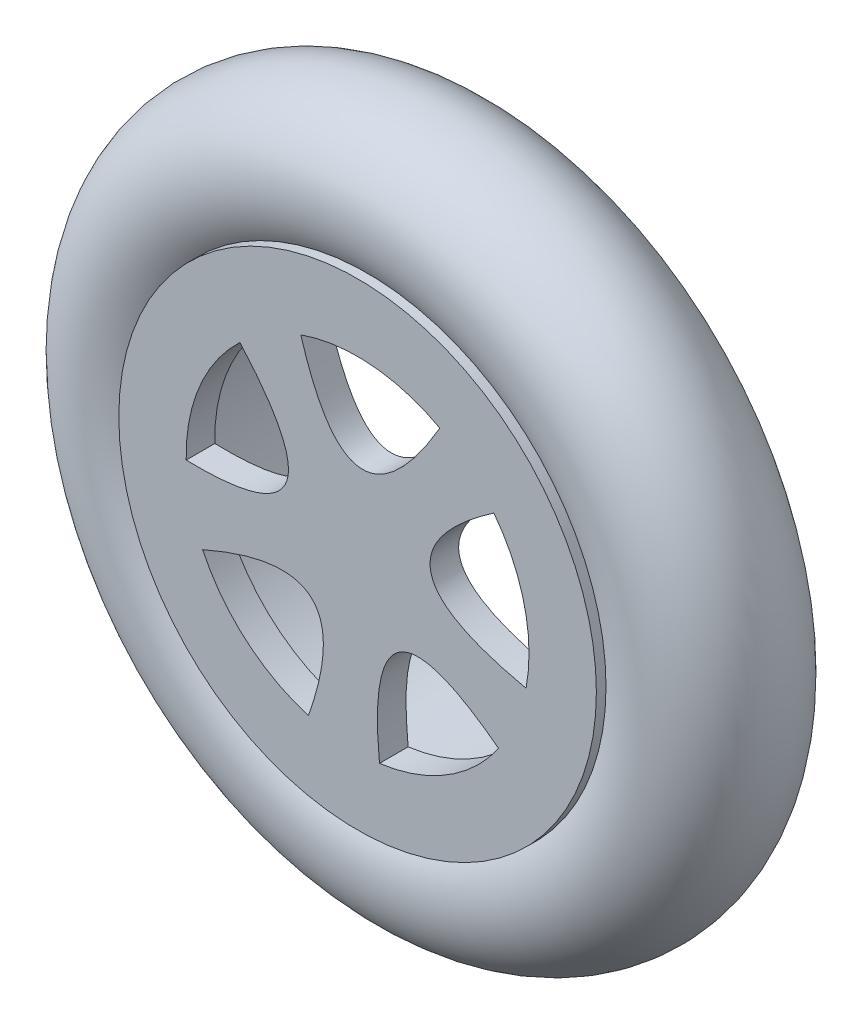
ISO-10303-21;
HEADER;
FILE_DESCRIPTION(('STEP AP214'),'2;1');
FILE_NAME('part.step','',(''),(''),'','','');
FILE_SCHEMA(('AUTOMOTIVE_DESIGN { 1 0 10303 214 1 1 1 1 }'));
ENDSEC;
DATA;
#1=APPLICATION_CONTEXT('core data for automotive mechanical design processes');
#2=APPLICATION_PROTOCOL_DEFINITION('international standard','automotive_design',2000,#1);
#3=PRODUCT_CONTEXT('',#1,'mechanical');
#4=PRODUCT('Part','Part','',(#3));
#5=PRODUCT_RELATED_PRODUCT_CATEGORY('part','',(#4));
#6=PRODUCT_DEFINITION_FORMATION('','',#4);
#7=PRODUCT_DEFINITION_CONTEXT('part definition',#1,'design');
#8=PRODUCT_DEFINITION('design','',#6,#7);
#9=PRODUCT_DEFINITION_SHAPE('','',#8);
#10=(LENGTH_UNIT() NAMED_UNIT(*) SI_UNIT(.MILLI.,.METRE.));
#11=(NAMED_UNIT(*) PLANE_ANGLE_UNIT() SI_UNIT($,.RADIAN.));
#12=(NAMED_UNIT(*) SI_UNIT($,.STERADIAN.) SOLID_ANGLE_UNIT());
#13=UNCERTAINTY_MEASURE_WITH_UNIT(LENGTH_MEASURE(1.E-05),#10,'distance_accuracy_value','');
#14=(GEOMETRIC_REPRESENTATION_CONTEXT(3) GLOBAL_UNCERTAINTY_ASSIGNED_CONTEXT((#13)) GLOBAL_UNIT_ASSIGNED_CONTEXT((#10,
#11,#12)) REPRESENTATION_CONTEXT('',''));
#15=CARTESIAN_POINT('',(0.,0.,0.));
#16=DIRECTION('',(0.,0.,1.));
#17=DIRECTION('',(1.,0.,0.));
#18=AXIS2_PLACEMENT_3D('',#15,#16,#17);
#19=CARTESIAN_POINT('',(87.3649786951186,-16.4490272539585,76.2));
#20=CARTESIAN_POINT('',(-3.01769573823827,3.07763110089649,76.2));
#21=CARTESIAN_POINT('',(70.6825906567093,53.9182842647656,76.2));
#22=B_SPLINE_CURVE_WITH_KNOTS('',2,(#19,#20,#21),.UNSPECIFIED.,.F.,.F.,(3,3),(0.,1.),.UNSPECIFIED.);
#23=DIRECTION('',(0.,0.,-1.));
#24=VECTOR('',#23,1.);
#25=SURFACE_OF_LINEAR_EXTRUSION('',#22,#24);
#26=CARTESIAN_POINT('',(87.3649786951186,-16.4490272539585,61.3570823232408));
#27=CARTESIAN_POINT('',(-3.01769573823827,3.07763110089649,61.3570823232408));
#28=CARTESIAN_POINT('',(70.6825906567093,53.9182842647656,61.3570823232408));
#29=B_SPLINE_CURVE_WITH_KNOTS('',2,(#26,#27,#28),.UNSPECIFIED.,.F.,.F.,(3,3),(0.,1.),.UNSPECIFIED.);
#30=CARTESIAN_POINT('',(70.6825906567093,53.9182842647656,61.3570823232408));
#31=VERTEX_POINT('',#30);
#32=CARTESIAN_POINT('',(87.3649786951186,-16.4490272539585,61.3570823232408));
#33=VERTEX_POINT('',#32);
#34=EDGE_CURVE('E67',#31,#33,#29,.F.);
#35=ORIENTED_EDGE('',*,*,#34,.F.);
#36=DIRECTION('',(0.,0.,-1.));
#37=VECTOR('',#36,1.);
#38=CARTESIAN_POINT('',(70.6825906567093,53.9182842647656,76.2));
#39=LINE('',#38,#37);
#40=CARTESIAN_POINT('',(70.6825906567093,53.9182842647656,76.2));
#41=VERTEX_POINT('',#40);
#42=EDGE_CURVE('E238',#41,#31,#39,.T.);
#43=ORIENTED_EDGE('',*,*,#42,.F.);
#44=CARTESIAN_POINT('',(87.3649786951186,-16.4490272539585,76.2));
#45=VERTEX_POINT('',#44);
#46=EDGE_CURVE('E223',#45,#41,#22,.T.);
#47=ORIENTED_EDGE('',*,*,#46,.F.);
#48=DIRECTION('',(0.,0.,-1.));
#49=VECTOR('',#48,1.);
#50=CARTESIAN_POINT('',(87.3649786951186,-16.4490272539585,76.2));
#51=LINE('',#50,#49);
#52=EDGE_CURVE('E239',#45,#33,#51,.T.);
#53=ORIENTED_EDGE('',*,*,#52,.T.);
#54=EDGE_LOOP('',(#35,#43,#47,#53));
#55=FACE_BOUND('',#54,.T.);
#56=ADVANCED_FACE('F53',(#55),#25,.F.);
#57=CARTESIAN_POINT('',(0.,0.,76.2));
#58=DIRECTION('',(0.,0.,-1.));
#59=DIRECTION('',(-1.,0.,0.));
#60=AXIS2_PLACEMENT_3D('',#57,#58,#59);
#61=CYLINDRICAL_SURFACE('',#60,88.9);
#62=CARTESIAN_POINT('',(0.,0.,61.3570823232408));
#63=DIRECTION('',(0.,0.,-1.));
#64=DIRECTION('',(-1.,0.,0.));
#65=AXIS2_PLACEMENT_3D('',#62,#63,#64);
#66=CIRCLE('',#65,88.9);
#67=EDGE_CURVE('E299',#33,#31,#66,.F.);
#68=ORIENTED_EDGE('',*,*,#67,.F.);
#69=ORIENTED_EDGE('',*,*,#52,.F.);
#70=CARTESIAN_POINT('',(0.,0.,76.2));
#71=DIRECTION('',(0.,0.,-1.));
#72=DIRECTION('',(-1.,0.,0.));
#73=AXIS2_PLACEMENT_3D('',#70,#71,#72);
#74=CIRCLE('',#73,88.9);
#75=EDGE_CURVE('E230',#41,#45,#74,.T.);
#76=ORIENTED_EDGE('',*,*,#75,.F.);
#77=ORIENTED_EDGE('',*,*,#42,.T.);
#78=EDGE_LOOP('',(#68,#69,#76,#77));
#79=FACE_BOUND('',#78,.T.);
#80=ADVANCED_FACE('F213',(#79),#61,.F.);
#81=CARTESIAN_POINT('',(11.353308573403,-88.1720612463897,76.2));
#82=CARTESIAN_POINT('',(1.99448184629178,3.82103950864149,76.2));
#83=CARTESIAN_POINT('',(73.1214573168308,-50.5614722873345,76.2));
#84=B_SPLINE_CURVE_WITH_KNOTS('',2,(#81,#82,#83),.UNSPECIFIED.,.F.,.F.,(3,3),(0.,1.),.UNSPECIFIED.);
#85=DIRECTION('',(0.,0.,-1.));
#86=VECTOR('',#85,1.);
#87=SURFACE_OF_LINEAR_EXTRUSION('',#84,#86);
#88=CARTESIAN_POINT('',(11.353308573403,-88.1720612463897,61.3570823232408));
#89=CARTESIAN_POINT('',(1.99448184629178,3.82103950864149,61.3570823232408));
#90=CARTESIAN_POINT('',(73.1214573168308,-50.5614722873345,61.3570823232408));
#91=B_SPLINE_CURVE_WITH_KNOTS('',2,(#88,#89,#90),.UNSPECIFIED.,.F.,.F.,(3,3),(0.,1.),.UNSPECIFIED.);
#92=CARTESIAN_POINT('',(73.1214573168308,-50.5614722873345,61.3570823232408));
#93=VERTEX_POINT('',#92);
#94=CARTESIAN_POINT('',(11.353308573403,-88.1720612463897,61.3570823232408));
#95=VERTEX_POINT('',#94);
#96=EDGE_CURVE('E74',#93,#95,#91,.F.);
#97=ORIENTED_EDGE('',*,*,#96,.F.);
#98=DIRECTION('',(0.,0.,-1.));
#99=VECTOR('',#98,1.);
#100=CARTESIAN_POINT('',(73.1214573168308,-50.5614722873345,76.2));
#101=LINE('',#100,#99);
#102=CARTESIAN_POINT('',(73.1214573168308,-50.5614722873345,76.2));
#103=VERTEX_POINT('',#102);
#104=EDGE_CURVE('E232',#103,#93,#101,.T.);
#105=ORIENTED_EDGE('',*,*,#104,.F.);
#106=CARTESIAN_POINT('',(11.353308573403,-88.1720612463897,76.2));
#107=VERTEX_POINT('',#106);
#108=EDGE_CURVE('E195',#107,#103,#84,.T.);
#109=ORIENTED_EDGE('',*,*,#108,.F.);
#110=DIRECTION('',(0.,0.,-1.));
#111=VECTOR('',#110,1.);
#112=CARTESIAN_POINT('',(11.353308573403,-88.1720612463897,76.2));
#113=LINE('',#112,#111);
#114=EDGE_CURVE('E231',#107,#95,#113,.T.);
#115=ORIENTED_EDGE('',*,*,#114,.T.);
#116=EDGE_LOOP('',(#97,#105,#109,#115));
#117=FACE_BOUND('',#116,.T.);
#118=ADVANCED_FACE('F209',(#117),#87,.F.);
#119=CARTESIAN_POINT('',(0.,0.,76.2));
#120=DIRECTION('',(0.,0.,-1.));
#121=DIRECTION('',(-1.,0.,0.));
#122=AXIS2_PLACEMENT_3D('',#119,#120,#121);
#123=CYLINDRICAL_SURFACE('',#122,88.9);
#124=CARTESIAN_POINT('',(0.,0.,61.3570823232408));
#125=DIRECTION('',(0.,0.,-1.));
#126=DIRECTION('',(-1.,0.,0.));
#127=AXIS2_PLACEMENT_3D('',#124,#125,#126);
#128=CIRCLE('',#127,88.9);
#129=EDGE_CURVE('E294',#95,#93,#128,.F.);
#130=ORIENTED_EDGE('',*,*,#129,.F.);
#131=ORIENTED_EDGE('',*,*,#114,.F.);
#132=CARTESIAN_POINT('',(0.,0.,76.2));
#133=DIRECTION('',(0.,0.,-1.));
#134=DIRECTION('',(-1.,0.,0.));
#135=AXIS2_PLACEMENT_3D('',#132,#133,#134);
#136=CIRCLE('',#135,88.9);
#137=EDGE_CURVE('E203',#103,#107,#136,.T.);
#138=ORIENTED_EDGE('',*,*,#137,.F.);
#139=ORIENTED_EDGE('',*,*,#104,.T.);
#140=EDGE_LOOP('',(#130,#131,#138,#139));
#141=FACE_BOUND('',#140,.T.);
#142=ADVANCED_FACE('F212',(#141),#123,.F.);
#143=CARTESIAN_POINT('',(0.,0.,76.2));
#144=DIRECTION('',(0.,0.,-1.));
#145=DIRECTION('',(-1.,0.,0.));
#146=AXIS2_PLACEMENT_3D('',#143,#144,#145);
#147=CYLINDRICAL_SURFACE('',#146,88.9);
#148=CARTESIAN_POINT('',(0.,0.,61.3570823232408));
#149=DIRECTION('',(0.,0.,-1.));
#150=DIRECTION('',(-1.,0.,0.));
#151=AXIS2_PLACEMENT_3D('',#148,#149,#150);
#152=CIRCLE('',#151,88.9);
#153=CARTESIAN_POINT('',(-80.34824811199,-38.0443034544478,61.3570823232408));
#154=VERTEX_POINT('',#153);
#155=CARTESIAN_POINT('',(-25.4910447279832,-85.1669926595742,61.3570823232408));
#156=VERTEX_POINT('',#155);
#157=EDGE_CURVE('E289',#154,#156,#152,.F.);
#158=ORIENTED_EDGE('',*,*,#157,.F.);
#159=DIRECTION('',(0.,0.,-1.));
#160=VECTOR('',#159,1.);
#161=CARTESIAN_POINT('',(-80.34824811199,-38.0443034544478,76.2));
#162=LINE('',#161,#160);
#163=CARTESIAN_POINT('',(-80.34824811199,-38.0443034544478,76.2));
#164=VERTEX_POINT('',#163);
#165=EDGE_CURVE('E186',#164,#154,#162,.T.);
#166=ORIENTED_EDGE('',*,*,#165,.F.);
#167=CARTESIAN_POINT('',(0.,0.,76.2));
#168=DIRECTION('',(0.,0.,-1.));
#169=DIRECTION('',(-1.,0.,0.));
#170=AXIS2_PLACEMENT_3D('',#167,#168,#169);
#171=CIRCLE('',#170,88.9);
#172=CARTESIAN_POINT('',(-25.4910447279832,-85.1669926595742,76.2));
#173=VERTEX_POINT('',#172);
#174=EDGE_CURVE('E187',#173,#164,#171,.T.);
#175=ORIENTED_EDGE('',*,*,#174,.F.);
#176=DIRECTION('',(0.,0.,-1.));
#177=VECTOR('',#176,1.);
#178=CARTESIAN_POINT('',(-25.4910447279832,-85.1669926595742,76.2));
#179=LINE('',#178,#177);
#180=EDGE_CURVE('E189',#173,#156,#179,.T.);
#181=ORIENTED_EDGE('',*,*,#180,.T.);
#182=EDGE_LOOP('',(#158,#166,#175,#181));
#183=FACE_BOUND('',#182,.T.);
#184=ADVANCED_FACE('F176',(#183),#147,.F.);
#185=CARTESIAN_POINT('',(-80.34824811199,-38.0443034544478,76.2));
#186=CARTESIAN_POINT('',(4.25035330919125,-0.716098812199793,76.2));
#187=CARTESIAN_POINT('',(-25.4910447279832,-85.1669926595742,76.2));
#188=B_SPLINE_CURVE_WITH_KNOTS('',2,(#185,#186,#187),.UNSPECIFIED.,.F.,.F.,(3,3),(0.,1.),.UNSPECIFIED.);
#189=DIRECTION('',(0.,0.,-1.));
#190=VECTOR('',#189,1.);
#191=SURFACE_OF_LINEAR_EXTRUSION('',#188,#190);
#192=CARTESIAN_POINT('',(-80.34824811199,-38.0443034544478,61.3570823232408));
#193=CARTESIAN_POINT('',(4.25035330919125,-0.716098812199793,61.3570823232408));
#194=CARTESIAN_POINT('',(-25.4910447279832,-85.1669926595742,61.3570823232408));
#195=B_SPLINE_CURVE_WITH_KNOTS('',2,(#192,#193,#194),.UNSPECIFIED.,.F.,.F.,(3,3),(0.,1.),.UNSPECIFIED.);
#196=EDGE_CURVE('E282',#156,#154,#195,.F.);
#197=ORIENTED_EDGE('',*,*,#196,.F.);
#198=ORIENTED_EDGE('',*,*,#180,.F.);
#199=EDGE_CURVE('E179',#164,#173,#188,.T.);
#200=ORIENTED_EDGE('',*,*,#199,.F.);
#201=ORIENTED_EDGE('',*,*,#165,.T.);
#202=EDGE_LOOP('',(#197,#198,#200,#201));
#203=FACE_BOUND('',#202,.T.);
#204=ADVANCED_FACE('F170',(#203),#191,.F.);
#205=CARTESIAN_POINT('',(-61.0112568431225,64.6593886332259,76.2));
#206=CARTESIAN_POINT('',(0.632380962984039,-4.26361291388443,76.2));
#207=CARTESIAN_POINT('',(-88.8757893674683,-2.07462389589522,76.2));
#208=B_SPLINE_CURVE_WITH_KNOTS('',2,(#205,#206,#207),.UNSPECIFIED.,.F.,.F.,(3,3),(0.,1.),.UNSPECIFIED.);
#209=DIRECTION('',(0.,0.,-1.));
#210=VECTOR('',#209,1.);
#211=SURFACE_OF_LINEAR_EXTRUSION('',#208,#210);
#212=CARTESIAN_POINT('',(-61.0112568431225,64.6593886332259,61.3570823232408));
#213=CARTESIAN_POINT('',(0.632380962984039,-4.26361291388443,61.3570823232408));
#214=CARTESIAN_POINT('',(-88.8757893674683,-2.07462389589522,61.3570823232408));
#215=B_SPLINE_CURVE_WITH_KNOTS('',2,(#212,#213,#214),.UNSPECIFIED.,.F.,.F.,(3,3),(0.,1.),.UNSPECIFIED.);
#216=CARTESIAN_POINT('',(-88.8757893674682,-2.07462389589516,61.3570823232408));
#217=VERTEX_POINT('',#216);
#218=CARTESIAN_POINT('',(-61.0112568431224,64.6593886332259,61.3570823232408));
#219=VERTEX_POINT('',#218);
#220=EDGE_CURVE('E278',#217,#219,#215,.F.);
#221=ORIENTED_EDGE('',*,*,#220,.F.);
#222=DIRECTION('',(0.,0.,-1.));
#223=VECTOR('',#222,1.);
#224=CARTESIAN_POINT('',(-88.8757893674683,-2.07462389589516,76.2));
#225=LINE('',#224,#223);
#226=CARTESIAN_POINT('',(-88.8757893674683,-2.07462389589516,76.2));
#227=VERTEX_POINT('',#226);
#228=EDGE_CURVE('E345',#227,#217,#225,.T.);
#229=ORIENTED_EDGE('',*,*,#228,.F.);
#230=CARTESIAN_POINT('',(-61.0112568431224,64.6593886332259,76.2));
#231=VERTEX_POINT('',#230);
#232=EDGE_CURVE('E149',#231,#227,#208,.T.);
#233=ORIENTED_EDGE('',*,*,#232,.F.);
#234=DIRECTION('',(0.,0.,-1.));
#235=VECTOR('',#234,1.);
#236=CARTESIAN_POINT('',(-61.0112568431224,64.6593886332259,76.2));
#237=LINE('',#236,#235);
#238=EDGE_CURVE('E343',#231,#219,#237,.T.);
#239=ORIENTED_EDGE('',*,*,#238,.T.);
#240=EDGE_LOOP('',(#221,#229,#233,#239));
#241=FACE_BOUND('',#240,.T.);
#242=ADVANCED_FACE('F165',(#241),#211,.F.);
#243=CARTESIAN_POINT('',(0.,0.,76.2));
#244=DIRECTION('',(0.,0.,-1.));
#245=DIRECTION('',(-1.,0.,0.));
#246=AXIS2_PLACEMENT_3D('',#243,#244,#245);
#247=CYLINDRICAL_SURFACE('',#246,88.9);
#248=CARTESIAN_POINT('',(0.,0.,61.3570823232408));
#249=DIRECTION('',(0.,0.,-1.));
#250=DIRECTION('',(-1.,0.,0.));
#251=AXIS2_PLACEMENT_3D('',#248,#249,#250);
#252=CIRCLE('',#251,88.9);
#253=EDGE_CURVE('E141',#219,#217,#252,.F.);
#254=ORIENTED_EDGE('',*,*,#253,.F.);
#255=ORIENTED_EDGE('',*,*,#238,.F.);
#256=CARTESIAN_POINT('',(0.,0.,76.2));
#257=DIRECTION('',(0.,0.,-1.));
#258=DIRECTION('',(-1.,0.,0.));
#259=AXIS2_PLACEMENT_3D('',#256,#257,#258);
#260=CIRCLE('',#259,88.9);
#261=EDGE_CURVE('E159',#227,#231,#260,.T.);
#262=ORIENTED_EDGE('',*,*,#261,.F.);
#263=ORIENTED_EDGE('',*,*,#228,.T.);
#264=EDGE_LOOP('',(#254,#255,#262,#263));
#265=FACE_BOUND('',#264,.T.);
#266=ADVANCED_FACE('F169',(#265),#247,.F.);
#267=CARTESIAN_POINT('',(42.6412176865906,78.00600332157,76.2));
#268=CARTESIAN_POINT('',(-3.85952038022872,-1.91895888345376,76.2));
#269=CARTESIAN_POINT('',(-29.4372138780887,83.8848045780383,76.2));
#270=B_SPLINE_CURVE_WITH_KNOTS('',2,(#267,#268,#269),.UNSPECIFIED.,.F.,.F.,(3,3),(0.,1.),.UNSPECIFIED.);
#271=DIRECTION('',(0.,0.,-1.));
#272=VECTOR('',#271,1.);
#273=SURFACE_OF_LINEAR_EXTRUSION('',#270,#272);
#274=CARTESIAN_POINT('',(42.6412176865906,78.00600332157,61.3570823232408));
#275=CARTESIAN_POINT('',(-3.85952038022872,-1.91895888345376,61.3570823232408));
#276=CARTESIAN_POINT('',(-29.4372138780887,83.8848045780383,61.3570823232408));
#277=B_SPLINE_CURVE_WITH_KNOTS('',2,(#274,#275,#276),.UNSPECIFIED.,.F.,.F.,(3,3),(0.,1.),.UNSPECIFIED.);
#278=CARTESIAN_POINT('',(-29.4372138780887,83.8848045780382,61.3570823232408));
#279=VERTEX_POINT('',#278);
#280=CARTESIAN_POINT('',(42.6412176865907,78.00600332157,61.3570823232408));
#281=VERTEX_POINT('',#280);
#282=EDGE_CURVE('E131',#279,#281,#277,.F.);
#283=ORIENTED_EDGE('',*,*,#282,.F.);
#284=DIRECTION('',(0.,0.,-1.));
#285=VECTOR('',#284,1.);
#286=CARTESIAN_POINT('',(-29.4372138780888,83.8848045780382,76.2));
#287=LINE('',#286,#285);
#288=CARTESIAN_POINT('',(-29.4372138780888,83.8848045780382,76.2));
#289=VERTEX_POINT('',#288);
#290=EDGE_CURVE('E138',#289,#279,#287,.T.);
#291=ORIENTED_EDGE('',*,*,#290,.F.);
#292=CARTESIAN_POINT('',(42.6412176865907,78.00600332157,76.2));
#293=VERTEX_POINT('',#292);
#294=EDGE_CURVE('E151',#293,#289,#270,.T.);
#295=ORIENTED_EDGE('',*,*,#294,.F.);
#296=DIRECTION('',(0.,0.,-1.));
#297=VECTOR('',#296,1.);
#298=CARTESIAN_POINT('',(42.6412176865907,78.00600332157,76.2));
#299=LINE('',#298,#297);
#300=EDGE_CURVE('E140',#293,#281,#299,.T.);
#301=ORIENTED_EDGE('',*,*,#300,.T.);
#302=EDGE_LOOP('',(#283,#291,#295,#301));
#303=FACE_BOUND('',#302,.T.);
#304=ADVANCED_FACE('F137',(#303),#273,.F.);
#305=CARTESIAN_POINT('',(0.,0.,76.2));
#306=DIRECTION('',(0.,0.,-1.));
#307=DIRECTION('',(-1.,0.,0.));
#308=AXIS2_PLACEMENT_3D('',#305,#306,#307);
#309=CYLINDRICAL_SURFACE('',#308,88.9);
#310=CARTESIAN_POINT('',(0.,0.,61.3570823232408));
#311=DIRECTION('',(0.,0.,-1.));
#312=DIRECTION('',(-1.,0.,0.));
#313=AXIS2_PLACEMENT_3D('',#310,#311,#312);
#314=CIRCLE('',#313,88.9);
#315=EDGE_CURVE('E12',#281,#279,#314,.F.);
#316=ORIENTED_EDGE('',*,*,#315,.F.);
#317=ORIENTED_EDGE('',*,*,#300,.F.);
#318=CARTESIAN_POINT('',(0.,0.,76.2));
#319=DIRECTION('',(0.,0.,-1.));
#320=DIRECTION('',(-1.,0.,0.));
#321=AXIS2_PLACEMENT_3D('',#318,#319,#320);
#322=CIRCLE('',#321,88.9);
#323=EDGE_CURVE('E146',#289,#293,#322,.T.);
#324=ORIENTED_EDGE('',*,*,#323,.F.);
#325=ORIENTED_EDGE('',*,*,#290,.T.);
#326=EDGE_LOOP('',(#316,#317,#324,#325));
#327=FACE_BOUND('',#326,.T.);
#328=ADVANCED_FACE('F144',(#327),#309,.F.);
#329=CARTESIAN_POINT('',(0.,0.,76.2));
#330=DIRECTION('',(0.,0.,-1.));
#331=DIRECTION('',(-1.,0.,0.));
#332=AXIS2_PLACEMENT_3D('',#329,#330,#331);
#333=CYLINDRICAL_SURFACE('',#332,123.825);
#334=CARTESIAN_POINT('',(0.,0.,76.2));
#335=DIRECTION('',(0.,0.,1.));
#336=DIRECTION('',(1.,0.,0.));
#337=AXIS2_PLACEMENT_3D('',#334,#335,#336);
#338=CIRCLE('',#337,123.825);
#339=CARTESIAN_POINT('',(-123.825,0.,76.2));
#340=VERTEX_POINT('',#339);
#341=EDGE_CURVE('E61',#340,#340,#338,.T.);
#342=CARTESIAN_POINT('',(0.,0.,71.2));
#343=DIRECTION('',(0.,0.,-1.));
#344=DIRECTION('',(-1.,0.,0.));
#345=AXIS2_PLACEMENT_3D('',#342,#343,#344);
#346=CIRCLE('',#345,123.825);
#347=CARTESIAN_POINT('',(-123.825,0.,71.2));
#348=VERTEX_POINT('',#347);
#349=EDGE_CURVE('E242',#348,#348,#346,.T.);
#350=CARTESIAN_POINT('',(-123.825,0.,76.2));
#351=CARTESIAN_POINT('',(-123.825,0.,76.1479166666667));
#352=CARTESIAN_POINT('',(-123.825,0.,76.0958333333333));
#353=CARTESIAN_POINT('',(-123.825,0.,75.9916666666667));
#354=CARTESIAN_POINT('',(-123.825,0.,75.9395833333333));
#355=CARTESIAN_POINT('',(-123.825,0.,75.8354166666667));
#356=CARTESIAN_POINT('',(-123.825,0.,75.7833333333333));
#357=CARTESIAN_POINT('',(-123.825,0.,75.6791666666667));
#358=CARTESIAN_POINT('',(-123.825,0.,75.6270833333333));
#359=CARTESIAN_POINT('',(-123.825,0.,75.5229166666667));
#360=CARTESIAN_POINT('',(-123.825,0.,75.4708333333333));
#361=CARTESIAN_POINT('',(-123.825,0.,75.3666666666667));
#362=CARTESIAN_POINT('',(-123.825,0.,75.3145833333333));
#363=CARTESIAN_POINT('',(-123.825,0.,75.2104166666667));
#364=CARTESIAN_POINT('',(-123.825,0.,75.1583333333333));
#365=CARTESIAN_POINT('',(-123.825,0.,75.0541666666667));
#366=CARTESIAN_POINT('',(-123.825,0.,75.0020833333333));
#367=CARTESIAN_POINT('',(-123.825,0.,74.8979166666667));
#368=CARTESIAN_POINT('',(-123.825,0.,74.8458333333333));
#369=CARTESIAN_POINT('',(-123.825,0.,74.7416666666667));
#370=CARTESIAN_POINT('',(-123.825,0.,74.6895833333333));
#371=CARTESIAN_POINT('',(-123.825,0.,74.5854166666667));
#372=CARTESIAN_POINT('',(-123.825,0.,74.5333333333333));
#373=CARTESIAN_POINT('',(-123.825,0.,74.4291666666667));
#374=CARTESIAN_POINT('',(-123.825,0.,74.3770833333333));
#375=CARTESIAN_POINT('',(-123.825,0.,74.2729166666667));
#376=CARTESIAN_POINT('',(-123.825,0.,74.2208333333333));
#377=CARTESIAN_POINT('',(-123.825,0.,74.1166666666667));
#378=CARTESIAN_POINT('',(-123.825,0.,74.0645833333333));
#379=CARTESIAN_POINT('',(-123.825,0.,73.9604166666667));
#380=CARTESIAN_POINT('',(-123.825,0.,73.9083333333333));
#381=CARTESIAN_POINT('',(-123.825,0.,73.8041666666667));
#382=CARTESIAN_POINT('',(-123.825,0.,73.7520833333333));
#383=CARTESIAN_POINT('',(-123.825,0.,73.6479166666667));
#384=CARTESIAN_POINT('',(-123.825,0.,73.5958333333333));
#385=CARTESIAN_POINT('',(-123.825,0.,73.4916666666667));
#386=CARTESIAN_POINT('',(-123.825,0.,73.4395833333333));
#387=CARTESIAN_POINT('',(-123.825,0.,73.3354166666667));
#388=CARTESIAN_POINT('',(-123.825,0.,73.2833333333333));
#389=CARTESIAN_POINT('',(-123.825,0.,73.1791666666667));
#390=CARTESIAN_POINT('',(-123.825,0.,73.1270833333333));
#391=CARTESIAN_POINT('',(-123.825,0.,73.0229166666667));
#392=CARTESIAN_POINT('',(-123.825,0.,72.9708333333333));
#393=CARTESIAN_POINT('',(-123.825,0.,72.8666666666667));
#394=CARTESIAN_POINT('',(-123.825,0.,72.8145833333333));
#395=CARTESIAN_POINT('',(-123.825,0.,72.7104166666667));
#396=CARTESIAN_POINT('',(-123.825,0.,72.6583333333333));
#397=CARTESIAN_POINT('',(-123.825,0.,72.5541666666667));
#398=CARTESIAN_POINT('',(-123.825,0.,72.5020833333333));
#399=CARTESIAN_POINT('',(-123.825,0.,72.3979166666667));
#400=CARTESIAN_POINT('',(-123.825,0.,72.3458333333333));
#401=CARTESIAN_POINT('',(-123.825,0.,72.2416666666667));
#402=CARTESIAN_POINT('',(-123.825,0.,72.1895833333333));
#403=CARTESIAN_POINT('',(-123.825,0.,72.0854166666667));
#404=CARTESIAN_POINT('',(-123.825,0.,72.0333333333333));
#405=CARTESIAN_POINT('',(-123.825,0.,71.9291666666667));
#406=CARTESIAN_POINT('',(-123.825,0.,71.8770833333333));
#407=CARTESIAN_POINT('',(-123.825,0.,71.7729166666667));
#408=CARTESIAN_POINT('',(-123.825,0.,71.7208333333333));
#409=CARTESIAN_POINT('',(-123.825,0.,71.6166666666667));
#410=CARTESIAN_POINT('',(-123.825,0.,71.5645833333333));
#411=CARTESIAN_POINT('',(-123.825,0.,71.4604166666667));
#412=CARTESIAN_POINT('',(-123.825,0.,71.4083333333333));
#413=CARTESIAN_POINT('',(-123.825,0.,71.3041666666667));
#414=CARTESIAN_POINT('',(-123.825,0.,71.2520833333333));
#415=CARTESIAN_POINT('',(-123.825,0.,71.2));
#416=B_SPLINE_CURVE_WITH_KNOTS('',3,(#350,#351,#352,#353,#354,#355,#356,#357,#358,#359,#360,
#361,#362,#363,#364,#365,#366,#367,#368,#369,#370,#371,#372,#373,#374,#375,#376,#377,#378,#379,
#380,#381,#382,#383,#384,#385,#386,#387,#388,#389,#390,#391,#392,#393,#394,#395,#396,#397,#398,
#399,#400,#401,#402,#403,#404,#405,#406,#407,#408,#409,#410,#411,#412,#413,#414,#415),
.UNSPECIFIED.,.F.,.F.,(4,2,2,2,2,2,2,2,2,2,2,2,2,2,2,2,2,2,2,2,2,2,2,2,2,2,2,2,2,2,2,2,4),(0.,
0.156250000000011,0.312500000000007,0.468750000000004,0.625000000000001,0.781250000000011,
0.937500000000008,1.09375,1.25,1.40625,1.56250000000001,1.71875,1.875,2.03125,2.18750000000001,
2.34375000000001,2.5,2.65625,2.8125,2.96875000000001,3.125,3.28125,3.4375,3.59375000000001,3.75,
3.90625,4.0625,4.21874999999999,4.375,4.53125,4.6875,4.84374999999999,5.),.UNSPECIFIED.);
#417=EDGE_CURVE('BSEAM55',#340,#348,#416,.T.);
#418=ORIENTED_EDGE('',*,*,#341,.F.);
#419=ORIENTED_EDGE('',*,*,#349,.F.);
#420=ORIENTED_EDGE('',*,*,#417,.T.);
#421=ORIENTED_EDGE('',*,*,#417,.F.);
#422=EDGE_LOOP('',(#418,#420,#419,#421));
#423=FACE_BOUND('',#422,.T.);
#424=ADVANCED_FACE('F55',(#423),#333,.T.);
#425=CARTESIAN_POINT('',(0.,0.,76.2));
#426=DIRECTION('',(0.,0.,1.));
#427=DIRECTION('',(1.,0.,0.));
#428=AXIS2_PLACEMENT_3D('',#425,#426,#427);
#429=PLANE('',#428);
#430=ORIENTED_EDGE('',*,*,#294,.T.);
#431=ORIENTED_EDGE('',*,*,#323,.T.);
#432=EDGE_LOOP('',(#430,#431));
#433=FACE_BOUND('',#432,.T.);
#434=ORIENTED_EDGE('',*,*,#232,.T.);
#435=ORIENTED_EDGE('',*,*,#261,.T.);
#436=EDGE_LOOP('',(#434,#435));
#437=FACE_BOUND('',#436,.T.);
#438=ORIENTED_EDGE('',*,*,#174,.T.);
#439=ORIENTED_EDGE('',*,*,#199,.T.);
#440=EDGE_LOOP('',(#438,#439));
#441=FACE_BOUND('',#440,.T.);
#442=ORIENTED_EDGE('',*,*,#108,.T.);
#443=ORIENTED_EDGE('',*,*,#137,.T.);
#444=EDGE_LOOP('',(#442,#443));
#445=FACE_BOUND('',#444,.T.);
#446=ORIENTED_EDGE('',*,*,#46,.T.);
#447=ORIENTED_EDGE('',*,*,#75,.T.);
#448=EDGE_LOOP('',(#446,#447));
#449=FACE_BOUND('',#448,.T.);
#450=ORIENTED_EDGE('',*,*,#341,.T.);
#451=EDGE_LOOP('',(#450));
#452=FACE_BOUND('',#451,.T.);
#453=ADVANCED_FACE('F222',(#433,#437,#441,#445,#449,#452),#429,.T.);
#454=CARTESIAN_POINT('',(0.,0.,0.));
#455=DIRECTION('',(0.,0.,1.));
#456=DIRECTION('',(1.,0.,0.));
#457=AXIS2_PLACEMENT_3D('',#454,#455,#456);
#458=PLANE('',#457);
#459=CARTESIAN_POINT('',(0.,0.,0.));
#460=DIRECTION('',(0.,0.,-1.));
#461=DIRECTION('',(-1.,0.,0.));
#462=AXIS2_PLACEMENT_3D('',#459,#460,#461);
#463=CIRCLE('',#462,103.876598788476);
#464=CARTESIAN_POINT('',(-103.876598788476,0.,0.));
#465=VERTEX_POINT('',#464);
#466=EDGE_CURVE('E266',#465,#465,#463,.T.);
#467=ORIENTED_EDGE('',*,*,#466,.F.);
#468=EDGE_LOOP('',(#467));
#469=FACE_BOUND('',#468,.T.);
#470=CARTESIAN_POINT('',(0.,0.,0.));
#471=DIRECTION('',(0.,0.,1.));
#472=DIRECTION('',(1.,0.,0.));
#473=AXIS2_PLACEMENT_3D('',#470,#471,#472);
#474=CIRCLE('',#473,123.825);
#475=CARTESIAN_POINT('',(-123.825,0.,0.));
#476=VERTEX_POINT('',#475);
#477=EDGE_CURVE('E247',#476,#476,#474,.T.);
#478=ORIENTED_EDGE('',*,*,#477,.F.);
#479=EDGE_LOOP('',(#478));
#480=FACE_BOUND('',#479,.T.);
#481=ADVANCED_FACE('F255',(#469,#480),#458,.F.);
#482=CARTESIAN_POINT('',(0.,0.,5.));
#483=DIRECTION('',(0.,0.,-1.));
#484=DIRECTION('',(-1.,0.,0.));
#485=AXIS2_PLACEMENT_3D('',#482,#483,#484);
#486=CIRCLE('',#485,123.825);
#487=CARTESIAN_POINT('',(-123.825,0.,5.));
#488=VERTEX_POINT('',#487);
#489=EDGE_CURVE('E307',#488,#488,#486,.T.);
#490=CARTESIAN_POINT('',(-123.825,0.,0.));
#491=CARTESIAN_POINT('',(-123.825,0.,0.0520833333333322));
#492=CARTESIAN_POINT('',(-123.825,0.,0.104166666666664));
#493=CARTESIAN_POINT('',(-123.825,0.,0.208333333333329));
#494=CARTESIAN_POINT('',(-123.825,0.,0.260416666666661));
#495=CARTESIAN_POINT('',(-123.825,0.,0.36458333333333));
#496=CARTESIAN_POINT('',(-123.825,0.,0.416666666666667));
#497=CARTESIAN_POINT('',(-123.825,0.,0.520833333333336));
#498=CARTESIAN_POINT('',(-123.825,0.,0.572916666666668));
#499=CARTESIAN_POINT('',(-123.825,0.,0.677083333333333));
#500=CARTESIAN_POINT('',(-123.825,0.,0.729166666666665));
#501=CARTESIAN_POINT('',(-123.825,0.,0.833333333333334));
#502=CARTESIAN_POINT('',(-123.825,0.,0.885416666666671));
#503=CARTESIAN_POINT('',(-123.825,0.,0.98958333333334));
#504=CARTESIAN_POINT('',(-123.825,0.,1.04166666666667));
#505=CARTESIAN_POINT('',(-123.825,0.,1.14583333333334));
#506=CARTESIAN_POINT('',(-123.825,0.,1.19791666666667));
#507=CARTESIAN_POINT('',(-123.825,0.,1.30208333333333));
#508=CARTESIAN_POINT('',(-123.825,0.,1.35416666666667));
#509=CARTESIAN_POINT('',(-123.825,0.,1.45833333333333));
#510=CARTESIAN_POINT('',(-123.825,0.,1.51041666666666));
#511=CARTESIAN_POINT('',(-123.825,0.,1.61458333333333));
#512=CARTESIAN_POINT('',(-123.825,0.,1.66666666666667));
#513=CARTESIAN_POINT('',(-123.825,0.,1.77083333333334));
#514=CARTESIAN_POINT('',(-123.825,0.,1.82291666666667));
#515=CARTESIAN_POINT('',(-123.825,0.,1.92708333333333));
#516=CARTESIAN_POINT('',(-123.825,0.,1.97916666666667));
#517=CARTESIAN_POINT('',(-123.825,0.,2.08333333333334));
#518=CARTESIAN_POINT('',(-123.825,0.,2.13541666666667));
#519=CARTESIAN_POINT('',(-123.825,0.,2.23958333333334));
#520=CARTESIAN_POINT('',(-123.825,0.,2.29166666666667));
#521=CARTESIAN_POINT('',(-123.825,0.,2.39583333333334));
#522=CARTESIAN_POINT('',(-123.825,0.,2.44791666666667));
#523=CARTESIAN_POINT('',(-123.825,0.,2.55208333333333));
#524=CARTESIAN_POINT('',(-123.825,0.,2.60416666666667));
#525=CARTESIAN_POINT('',(-123.825,0.,2.70833333333333));
#526=CARTESIAN_POINT('',(-123.825,0.,2.76041666666666));
#527=CARTESIAN_POINT('',(-123.825,0.,2.86458333333333));
#528=CARTESIAN_POINT('',(-123.825,0.,2.91666666666667));
#529=CARTESIAN_POINT('',(-123.825,0.,3.02083333333334));
#530=CARTESIAN_POINT('',(-123.825,0.,3.07291666666667));
#531=CARTESIAN_POINT('',(-123.825,0.,3.17708333333334));
#532=CARTESIAN_POINT('',(-123.825,0.,3.22916666666667));
#533=CARTESIAN_POINT('',(-123.825,0.,3.33333333333334));
#534=CARTESIAN_POINT('',(-123.825,0.,3.38541666666667));
#535=CARTESIAN_POINT('',(-123.825,0.,3.48958333333334));
#536=CARTESIAN_POINT('',(-123.825,0.,3.54166666666667));
#537=CARTESIAN_POINT('',(-123.825,0.,3.64583333333334));
#538=CARTESIAN_POINT('',(-123.825,0.,3.69791666666667));
#539=CARTESIAN_POINT('',(-123.825,0.,3.80208333333334));
#540=CARTESIAN_POINT('',(-123.825,0.,3.85416666666667));
#541=CARTESIAN_POINT('',(-123.825,0.,3.95833333333333));
#542=CARTESIAN_POINT('',(-123.825,0.,4.01041666666666));
#543=CARTESIAN_POINT('',(-123.825,0.,4.11458333333333));
#544=CARTESIAN_POINT('',(-123.825,0.,4.16666666666667));
#545=CARTESIAN_POINT('',(-123.825,0.,4.27083333333334));
#546=CARTESIAN_POINT('',(-123.825,0.,4.32291666666667));
#547=CARTESIAN_POINT('',(-123.825,0.,4.42708333333334));
#548=CARTESIAN_POINT('',(-123.825,0.,4.47916666666667));
#549=CARTESIAN_POINT('',(-123.825,0.,4.58333333333334));
#550=CARTESIAN_POINT('',(-123.825,0.,4.63541666666667));
#551=CARTESIAN_POINT('',(-123.825,0.,4.73958333333334));
#552=CARTESIAN_POINT('',(-123.825,0.,4.79166666666668));
#553=CARTESIAN_POINT('',(-123.825,0.,4.89583333333334));
#554=CARTESIAN_POINT('',(-123.825,0.,4.94791666666667));
#555=CARTESIAN_POINT('',(-123.825,0.,5.));
#556=B_SPLINE_CURVE_WITH_KNOTS('',3,(#490,#491,#492,#493,#494,#495,#496,#497,#498,#499,#500,
#501,#502,#503,#504,#505,#506,#507,#508,#509,#510,#511,#512,#513,#514,#515,#516,#517,#518,#519,
#520,#521,#522,#523,#524,#525,#526,#527,#528,#529,#530,#531,#532,#533,#534,#535,#536,#537,#538,
#539,#540,#541,#542,#543,#544,#545,#546,#547,#548,#549,#550,#551,#552,#553,#554,#555),
.UNSPECIFIED.,.F.,.F.,(4,2,2,2,2,2,2,2,2,2,2,2,2,2,2,2,2,2,2,2,2,2,2,2,2,2,2,2,2,2,2,2,4),(0.,
0.156249999999997,0.312499999999993,0.468750000000004,0.625000000000001,0.781249999999997,
0.937500000000008,1.09375,1.25,1.40625,1.56249999999999,1.71875,1.875,2.03125,2.18750000000001,
2.34375000000001,2.5,2.65625,2.8125,2.96875000000001,3.125,3.28125,3.43750000000001,
3.59375000000001,3.75,3.90625,4.0625,4.21875000000001,4.375,4.53125,4.68750000000001,
4.84375000000001,5.),.UNSPECIFIED.);
#557=EDGE_CURVE('BSEAM252',#476,#488,#556,.T.);
#558=ORIENTED_EDGE('',*,*,#477,.T.);
#559=ORIENTED_EDGE('',*,*,#489,.T.);
#560=ORIENTED_EDGE('',*,*,#557,.T.);
#561=ORIENTED_EDGE('',*,*,#557,.F.);
#562=EDGE_LOOP('',(#558,#560,#559,#561));
#563=FACE_BOUND('',#562,.T.);
#564=ADVANCED_FACE('F252',(#563),#333,.T.);
#565=CARTESIAN_POINT('',(0.,0.,38.1));
#566=DIRECTION('',(0.,0.,-1.));
#567=DIRECTION('',(-1.,0.,0.));
#568=AXIS2_PLACEMENT_3D('',#565,#566,#567);
#569=TOROIDAL_SURFACE('',#568,144.469772675669,39.0104683236441);
#570=ORIENTED_EDGE('',*,*,#349,.T.);
#571=EDGE_LOOP('',(#570));
#572=FACE_BOUND('',#571,.T.);
#573=ORIENTED_EDGE('',*,*,#489,.F.);
#574=EDGE_LOOP('',(#573));
#575=FACE_BOUND('',#574,.T.);
#576=ADVANCED_FACE('F262',(#572,#575),#569,.T.);
#577=CARTESIAN_POINT('',(0.,0.,61.3570823232408));
#578=DIRECTION('',(0.,0.,-1.));
#579=DIRECTION('',(-1.,0.,0.));
#580=AXIS2_PLACEMENT_3D('',#577,#578,#579);
#581=PLANE('',#580);
#582=ORIENTED_EDGE('',*,*,#96,.T.);
#583=ORIENTED_EDGE('',*,*,#129,.T.);
#584=EDGE_LOOP('',(#582,#583));
#585=FACE_BOUND('',#584,.T.);
#586=ORIENTED_EDGE('',*,*,#220,.T.);
#587=ORIENTED_EDGE('',*,*,#253,.T.);
#588=EDGE_LOOP('',(#586,#587));
#589=FACE_BOUND('',#588,.T.);
#590=CARTESIAN_POINT('',(0.,0.,61.3570823232408));
#591=DIRECTION('',(0.,0.,-1.));
#592=DIRECTION('',(-1.,0.,0.));
#593=AXIS2_PLACEMENT_3D('',#590,#591,#592);
#594=CIRCLE('',#593,103.876598788476);
#595=CARTESIAN_POINT('',(-103.876598788476,0.,61.3570823232408));
#596=VERTEX_POINT('',#595);
#597=EDGE_CURVE('E142',#596,#596,#594,.T.);
#598=ORIENTED_EDGE('',*,*,#597,.T.);
#599=EDGE_LOOP('',(#598));
#600=FACE_BOUND('',#599,.T.);
#601=ORIENTED_EDGE('',*,*,#282,.T.);
#602=ORIENTED_EDGE('',*,*,#315,.T.);
#603=EDGE_LOOP('',(#601,#602));
#604=FACE_BOUND('',#603,.T.);
#605=ORIENTED_EDGE('',*,*,#157,.T.);
#606=ORIENTED_EDGE('',*,*,#196,.T.);
#607=EDGE_LOOP('',(#605,#606));
#608=FACE_BOUND('',#607,.T.);
#609=ORIENTED_EDGE('',*,*,#34,.T.);
#610=ORIENTED_EDGE('',*,*,#67,.T.);
#611=EDGE_LOOP('',(#609,#610));
#612=FACE_BOUND('',#611,.T.);
#613=ADVANCED_FACE('F129',(#585,#589,#600,#604,#608,#612),#581,.T.);
#614=CARTESIAN_POINT('',(0.,0.,61.3570823232408));
#615=DIRECTION('',(0.,0.,-1.));
#616=DIRECTION('',(-1.,0.,0.));
#617=AXIS2_PLACEMENT_3D('',#614,#615,#616);
#618=CYLINDRICAL_SURFACE('',#617,103.876598788476);
#619=ORIENTED_EDGE('',*,*,#597,.F.);
#620=EDGE_LOOP('',(#619));
#621=FACE_BOUND('',#620,.T.);
#622=ORIENTED_EDGE('',*,*,#466,.T.);
#623=EDGE_LOOP('',(#622));
#624=FACE_BOUND('',#623,.T.);
#625=ADVANCED_FACE('F326',(#621,#624),#618,.F.);
#626=CLOSED_SHELL('',(#56,#80,#118,#142,#184,#204,#242,#266,#304,#328,#424,#453,#481,#564,#576,
#613,#625));
#627=MANIFOLD_SOLID_BREP('B2',#626);
#628=ADVANCED_BREP_SHAPE_REPRESENTATION('',(#18,#627),#14);
#629=SHAPE_DEFINITION_REPRESENTATION(#9,#628);
ENDSEC;
END-ISO-10303-21;
